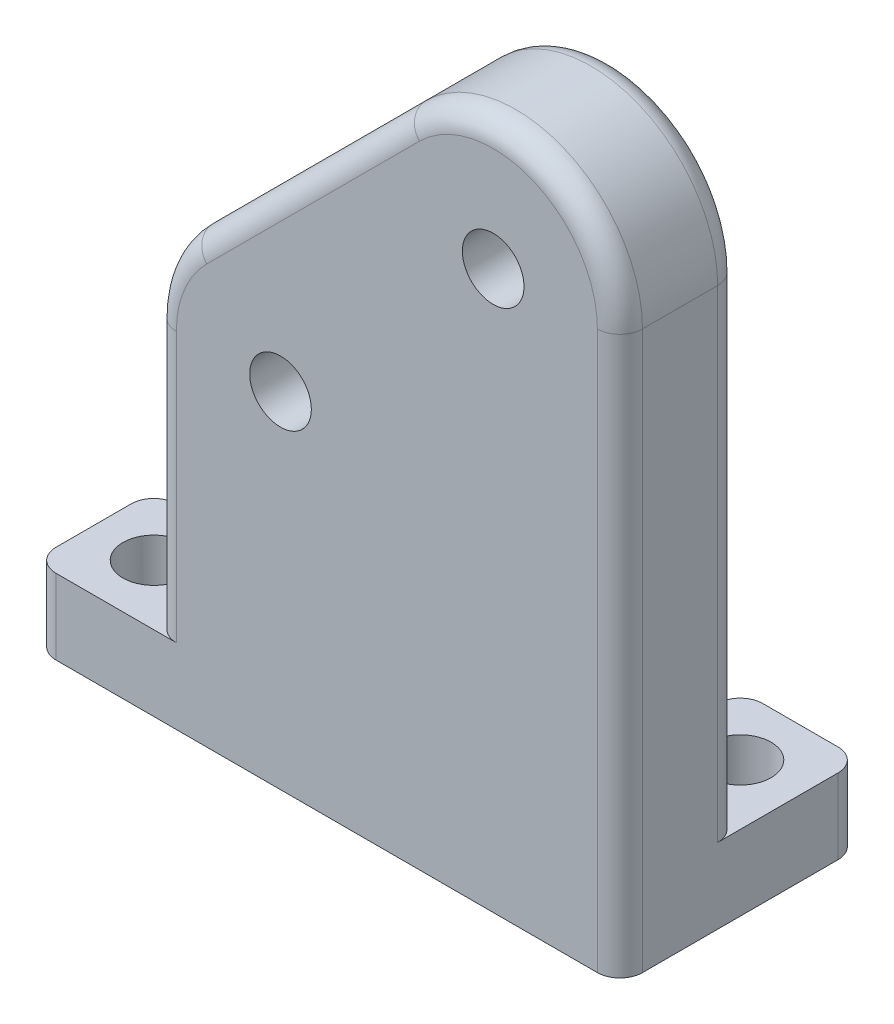
ISO-10303-21;
HEADER;
FILE_DESCRIPTION(('STEP AP214'),'2;1');
FILE_NAME('part.step','',(''),(''),'','','');
FILE_SCHEMA(('AUTOMOTIVE_DESIGN { 1 0 10303 214 1 1 1 1 }'));
ENDSEC;
DATA;
#1=APPLICATION_CONTEXT('core data for automotive mechanical design processes');
#2=APPLICATION_PROTOCOL_DEFINITION('international standard','automotive_design',2000,#1);
#3=PRODUCT_CONTEXT('',#1,'mechanical');
#4=PRODUCT('Part','Part','',(#3));
#5=PRODUCT_RELATED_PRODUCT_CATEGORY('part','',(#4));
#6=PRODUCT_DEFINITION_FORMATION('','',#4);
#7=PRODUCT_DEFINITION_CONTEXT('part definition',#1,'design');
#8=PRODUCT_DEFINITION('design','',#6,#7);
#9=PRODUCT_DEFINITION_SHAPE('','',#8);
#10=(LENGTH_UNIT() NAMED_UNIT(*) SI_UNIT(.MILLI.,.METRE.));
#11=(NAMED_UNIT(*) PLANE_ANGLE_UNIT() SI_UNIT($,.RADIAN.));
#12=(NAMED_UNIT(*) SI_UNIT($,.STERADIAN.) SOLID_ANGLE_UNIT());
#13=UNCERTAINTY_MEASURE_WITH_UNIT(LENGTH_MEASURE(1.E-05),#10,'distance_accuracy_value','');
#14=(GEOMETRIC_REPRESENTATION_CONTEXT(3) GLOBAL_UNCERTAINTY_ASSIGNED_CONTEXT((#13)) GLOBAL_UNIT_ASSIGNED_CONTEXT((#10,
#11,#12)) REPRESENTATION_CONTEXT('',''));
#15=CARTESIAN_POINT('',(0.,0.,0.));
#16=DIRECTION('',(0.,0.,1.));
#17=DIRECTION('',(1.,0.,0.));
#18=AXIS2_PLACEMENT_3D('',#15,#16,#17);
#19=CARTESIAN_POINT('',(16.4289321881346,22.9289321881346,8.));
#20=DIRECTION('',(0.,0.,1.));
#21=DIRECTION('',(1.,0.,0.));
#22=AXIS2_PLACEMENT_3D('',#19,#20,#21);
#23=PLANE('',#22);
#24=CARTESIAN_POINT('',(16.4289321881346,22.9289321881346,8.));
#25=DIRECTION('',(0.,0.,1.));
#26=DIRECTION('',(1.,0.,0.));
#27=AXIS2_PLACEMENT_3D('',#24,#25,#26);
#28=CIRCLE('',#27,2.05);
#29=CARTESIAN_POINT('',(18.4789321881346,22.9289321881346,8.));
#30=VERTEX_POINT('',#29);
#31=EDGE_CURVE('E207',#30,#30,#28,.T.);
#32=ORIENTED_EDGE('',*,*,#31,.F.);
#33=EDGE_LOOP('',(#32));
#34=FACE_BOUND('',#33,.T.);
#35=DIRECTION('',(-1.,0.,0.));
#36=VECTOR('',#35,1.);
#37=CARTESIAN_POINT('',(0.,5.,8.));
#38=LINE('',#37,#36);
#39=CARTESIAN_POINT('',(9.5,5.,8.));
#40=VERTEX_POINT('',#39);
#41=CARTESIAN_POINT('',(1.5,5.,8.));
#42=VERTEX_POINT('',#41);
#43=EDGE_CURVE('E241',#40,#42,#38,.T.);
#44=ORIENTED_EDGE('',*,*,#43,.T.);
#45=DIRECTION('',(0.,-1.,0.));
#46=VECTOR('',#45,1.);
#47=CARTESIAN_POINT('',(1.5,0.,8.));
#48=LINE('',#47,#46);
#49=CARTESIAN_POINT('',(1.5,0.,8.));
#50=VERTEX_POINT('',#49);
#51=EDGE_CURVE('E279',#42,#50,#48,.T.);
#52=ORIENTED_EDGE('',*,*,#51,.T.);
#53=DIRECTION('',(1.,0.,0.));
#54=VECTOR('',#53,1.);
#55=CARTESIAN_POINT('',(0.,0.,8.));
#56=LINE('',#55,#54);
#57=CARTESIAN_POINT('',(37.5,0.,8.));
#58=VERTEX_POINT('',#57);
#59=EDGE_CURVE('E238',#50,#58,#56,.T.);
#60=ORIENTED_EDGE('',*,*,#59,.T.);
#61=DIRECTION('',(0.,1.,0.));
#62=VECTOR('',#61,1.);
#63=CARTESIAN_POINT('',(37.5,37.0710678118656,8.));
#64=LINE('',#63,#62);
#65=CARTESIAN_POINT('',(37.5,37.0710678118656,8.));
#66=VERTEX_POINT('',#65);
#67=EDGE_CURVE('E276',#58,#66,#64,.T.);
#68=ORIENTED_EDGE('',*,*,#67,.T.);
#69=CARTESIAN_POINT('',(30.5710678118654,37.0710678118656,8.));
#70=DIRECTION('',(0.,0.,1.));
#71=DIRECTION('',(1.,0.,0.));
#72=AXIS2_PLACEMENT_3D('',#69,#70,#71);
#73=CIRCLE('',#72,6.92893218813456);
#74=CARTESIAN_POINT('',(25.6715728752538,41.9705627484773,8.));
#75=VERTEX_POINT('',#74);
#76=EDGE_CURVE('E274',#66,#75,#73,.T.);
#77=ORIENTED_EDGE('',*,*,#76,.T.);
#78=DIRECTION('',(-0.707106781186546,-0.707106781186549,0.));
#79=VECTOR('',#78,1.);
#80=CARTESIAN_POINT('',(11.5294372515228,27.8284271247463,8.));
#81=LINE('',#80,#79);
#82=CARTESIAN_POINT('',(11.5294372515228,27.8284271247463,8.));
#83=VERTEX_POINT('',#82);
#84=EDGE_CURVE('E272',#75,#83,#81,.T.);
#85=ORIENTED_EDGE('',*,*,#84,.T.);
#86=CARTESIAN_POINT('',(16.4289321881346,22.9289321881346,8.));
#87=DIRECTION('',(0.,0.,1.));
#88=DIRECTION('',(1.,0.,0.));
#89=AXIS2_PLACEMENT_3D('',#86,#87,#88);
#90=CIRCLE('',#89,6.92893218813458);
#91=CARTESIAN_POINT('',(9.5,22.9289321881346,8.));
#92=VERTEX_POINT('',#91);
#93=EDGE_CURVE('E270',#83,#92,#90,.T.);
#94=ORIENTED_EDGE('',*,*,#93,.T.);
#95=DIRECTION('',(0.,-1.,0.));
#96=VECTOR('',#95,1.);
#97=CARTESIAN_POINT('',(9.5,5.,8.));
#98=LINE('',#97,#96);
#99=EDGE_CURVE('E267',#92,#40,#98,.T.);
#100=ORIENTED_EDGE('',*,*,#99,.T.);
#101=EDGE_LOOP('',(#44,#52,#60,#68,#77,#85,#94,#100));
#102=FACE_BOUND('',#101,.T.);
#103=CARTESIAN_POINT('',(30.5710678118654,37.0710678118656,8.));
#104=DIRECTION('',(0.,0.,1.));
#105=DIRECTION('',(-1.,0.,0.));
#106=AXIS2_PLACEMENT_3D('',#103,#104,#105);
#107=CIRCLE('',#106,2.04999999999999);
#108=CARTESIAN_POINT('',(28.5210678118655,37.0710678118656,8.));
#109=VERTEX_POINT('',#108);
#110=EDGE_CURVE('E228',#109,#109,#107,.T.);
#111=ORIENTED_EDGE('',*,*,#110,.F.);
#112=EDGE_LOOP('',(#111));
#113=FACE_BOUND('',#112,.T.);
#114=ADVANCED_FACE('F39',(#34,#102,#113),#23,.T.);
#115=CARTESIAN_POINT('',(16.4289321881346,22.9289321881346,0.));
#116=DIRECTION('',(0.,0.,1.));
#117=DIRECTION('',(1.,0.,0.));
#118=AXIS2_PLACEMENT_3D('',#115,#116,#117);
#119=PLANE('',#118);
#120=DIRECTION('',(1.,0.,0.));
#121=VECTOR('',#120,1.);
#122=CARTESIAN_POINT('',(0.,0.,0.));
#123=LINE('',#122,#121);
#124=CARTESIAN_POINT('',(1.5,0.,0.));
#125=VERTEX_POINT('',#124);
#126=CARTESIAN_POINT('',(31.0000000000001,0.,0.));
#127=VERTEX_POINT('',#126);
#128=EDGE_CURVE('E199',#125,#127,#123,.T.);
#129=ORIENTED_EDGE('',*,*,#128,.F.);
#130=DIRECTION('',(0.,-1.,0.));
#131=VECTOR('',#130,1.);
#132=CARTESIAN_POINT('',(1.5,22.9289321881346,0.));
#133=LINE('',#132,#131);
#134=CARTESIAN_POINT('',(1.5,5.,0.));
#135=VERTEX_POINT('',#134);
#136=EDGE_CURVE('E310',#125,#135,#133,.F.);
#137=ORIENTED_EDGE('',*,*,#136,.T.);
#138=DIRECTION('',(-1.,0.,0.));
#139=VECTOR('',#138,1.);
#140=CARTESIAN_POINT('',(0.,5.,0.));
#141=LINE('',#140,#139);
#142=CARTESIAN_POINT('',(9.5,5.,0.));
#143=VERTEX_POINT('',#142);
#144=EDGE_CURVE('E206',#143,#135,#141,.T.);
#145=ORIENTED_EDGE('',*,*,#144,.F.);
#146=DIRECTION('',(0.,-1.,0.));
#147=VECTOR('',#146,1.);
#148=CARTESIAN_POINT('',(9.5,22.9289321881346,0.));
#149=LINE('',#148,#147);
#150=CARTESIAN_POINT('',(9.49999999999998,22.9289321881346,0.));
#151=VERTEX_POINT('',#150);
#152=EDGE_CURVE('E302',#143,#151,#149,.F.);
#153=ORIENTED_EDGE('',*,*,#152,.T.);
#154=CARTESIAN_POINT('',(16.4289321881346,22.9289321881346,0.));
#155=DIRECTION('',(0.,0.,1.));
#156=DIRECTION('',(1.,0.,0.));
#157=AXIS2_PLACEMENT_3D('',#154,#155,#156);
#158=CIRCLE('',#157,6.92893218813458);
#159=CARTESIAN_POINT('',(11.5294372515228,27.8284271247463,0.));
#160=VERTEX_POINT('',#159);
#161=EDGE_CURVE('E300',#151,#160,#158,.F.);
#162=ORIENTED_EDGE('',*,*,#161,.T.);
#163=DIRECTION('',(-0.707106781186546,-0.707106781186549,0.));
#164=VECTOR('',#163,1.);
#165=CARTESIAN_POINT('',(11.5294372515228,27.8284271247463,0.));
#166=LINE('',#165,#164);
#167=CARTESIAN_POINT('',(25.6715728752538,41.9705627484773,0.));
#168=VERTEX_POINT('',#167);
#169=EDGE_CURVE('E304',#160,#168,#166,.F.);
#170=ORIENTED_EDGE('',*,*,#169,.T.);
#171=CARTESIAN_POINT('',(30.5710678118654,37.0710678118656,0.));
#172=DIRECTION('',(0.,0.,1.));
#173=DIRECTION('',(1.,0.,0.));
#174=AXIS2_PLACEMENT_3D('',#171,#172,#173);
#175=CIRCLE('',#174,6.92893218813456);
#176=CARTESIAN_POINT('',(37.5,37.0710678118656,0.));
#177=VERTEX_POINT('',#176);
#178=EDGE_CURVE('E306',#168,#177,#175,.F.);
#179=ORIENTED_EDGE('',*,*,#178,.T.);
#180=DIRECTION('',(0.,1.,0.));
#181=VECTOR('',#180,1.);
#182=CARTESIAN_POINT('',(37.5,22.9289321881346,0.));
#183=LINE('',#182,#181);
#184=CARTESIAN_POINT('',(37.5,5.,0.));
#185=VERTEX_POINT('',#184);
#186=EDGE_CURVE('E308',#177,#185,#183,.F.);
#187=ORIENTED_EDGE('',*,*,#186,.T.);
#188=DIRECTION('',(-1.,0.,0.));
#189=VECTOR('',#188,1.);
#190=CARTESIAN_POINT('',(0.,5.,0.));
#191=LINE('',#190,#189);
#192=CARTESIAN_POINT('',(31.0000000000001,5.,0.));
#193=VERTEX_POINT('',#192);
#194=EDGE_CURVE('E213',#185,#193,#191,.T.);
#195=ORIENTED_EDGE('',*,*,#194,.T.);
#196=DIRECTION('',(0.,-1.,0.));
#197=VECTOR('',#196,1.);
#198=CARTESIAN_POINT('',(31.0000000000001,0.,0.));
#199=LINE('',#198,#197);
#200=EDGE_CURVE('E191',#193,#127,#199,.T.);
#201=ORIENTED_EDGE('',*,*,#200,.T.);
#202=EDGE_LOOP('',(#129,#137,#145,#153,#162,#170,#179,#187,#195,#201));
#203=FACE_BOUND('',#202,.T.);
#204=CARTESIAN_POINT('',(16.4289321881346,22.9289321881346,0.));
#205=DIRECTION('',(0.,0.,1.));
#206=DIRECTION('',(1.,0.,0.));
#207=AXIS2_PLACEMENT_3D('',#204,#205,#206);
#208=CIRCLE('',#207,2.05);
#209=CARTESIAN_POINT('',(18.4789321881346,22.9289321881346,0.));
#210=VERTEX_POINT('',#209);
#211=EDGE_CURVE('E231',#210,#210,#208,.T.);
#212=ORIENTED_EDGE('',*,*,#211,.T.);
#213=EDGE_LOOP('',(#212));
#214=FACE_BOUND('',#213,.T.);
#215=CARTESIAN_POINT('',(30.5710678118654,37.0710678118656,0.));
#216=DIRECTION('',(0.,0.,1.));
#217=DIRECTION('',(-1.,0.,0.));
#218=AXIS2_PLACEMENT_3D('',#215,#216,#217);
#219=CIRCLE('',#218,2.04999999999999);
#220=CARTESIAN_POINT('',(28.5210678118655,37.0710678118656,0.));
#221=VERTEX_POINT('',#220);
#222=EDGE_CURVE('E227',#221,#221,#219,.T.);
#223=ORIENTED_EDGE('',*,*,#222,.T.);
#224=EDGE_LOOP('',(#223));
#225=FACE_BOUND('',#224,.T.);
#226=ADVANCED_FACE('F210',(#203,#214,#225),#119,.F.);
#227=CARTESIAN_POINT('',(0.,0.,8.));
#228=DIRECTION('',(1.,0.,0.));
#229=DIRECTION('',(0.,0.,-1.));
#230=AXIS2_PLACEMENT_3D('',#227,#228,#229);
#231=PLANE('',#230);
#232=DIRECTION('',(0.,0.,-1.));
#233=VECTOR('',#232,1.);
#234=CARTESIAN_POINT('',(0.,0.,8.));
#235=LINE('',#234,#233);
#236=CARTESIAN_POINT('',(0.,0.,6.5));
#237=VERTEX_POINT('',#236);
#238=CARTESIAN_POINT('',(0.,0.,1.5));
#239=VERTEX_POINT('',#238);
#240=EDGE_CURVE('E265',#237,#239,#235,.T.);
#241=ORIENTED_EDGE('',*,*,#240,.F.);
#242=DIRECTION('',(0.,-1.,0.));
#243=VECTOR('',#242,1.);
#244=CARTESIAN_POINT('',(0.,5.,6.5));
#245=LINE('',#244,#243);
#246=CARTESIAN_POINT('',(0.,5.,6.5));
#247=VERTEX_POINT('',#246);
#248=EDGE_CURVE('E294',#237,#247,#245,.F.);
#249=ORIENTED_EDGE('',*,*,#248,.T.);
#250=DIRECTION('',(0.,0.,-1.));
#251=VECTOR('',#250,1.);
#252=CARTESIAN_POINT('',(0.,5.,8.));
#253=LINE('',#252,#251);
#254=CARTESIAN_POINT('',(0.,5.,1.5));
#255=VERTEX_POINT('',#254);
#256=EDGE_CURVE('E243',#247,#255,#253,.T.);
#257=ORIENTED_EDGE('',*,*,#256,.T.);
#258=DIRECTION('',(0.,-1.,0.));
#259=VECTOR('',#258,1.);
#260=CARTESIAN_POINT('',(0.,0.,1.5));
#261=LINE('',#260,#259);
#262=EDGE_CURVE('E291',#255,#239,#261,.T.);
#263=ORIENTED_EDGE('',*,*,#262,.T.);
#264=EDGE_LOOP('',(#241,#249,#257,#263));
#265=FACE_BOUND('',#264,.T.);
#266=ADVANCED_FACE('F408',(#265),#231,.F.);
#267=CARTESIAN_POINT('',(0.,0.,8.));
#268=DIRECTION('',(0.,1.,0.));
#269=DIRECTION('',(0.,0.,1.));
#270=AXIS2_PLACEMENT_3D('',#267,#268,#269);
#271=PLANE('',#270);
#272=CARTESIAN_POINT('',(35.,0.,-4.));
#273=DIRECTION('',(0.,1.,0.));
#274=DIRECTION('',(0.,0.,1.));
#275=AXIS2_PLACEMENT_3D('',#272,#273,#274);
#276=CIRCLE('',#275,2.05);
#277=CARTESIAN_POINT('',(35.,0.,-1.95));
#278=VERTEX_POINT('',#277);
#279=EDGE_CURVE('E219',#278,#278,#276,.T.);
#280=ORIENTED_EDGE('',*,*,#279,.T.);
#281=EDGE_LOOP('',(#280));
#282=FACE_BOUND('',#281,.T.);
#283=CARTESIAN_POINT('',(4.,0.,4.));
#284=DIRECTION('',(0.,1.,0.));
#285=DIRECTION('',(0.,0.,1.));
#286=AXIS2_PLACEMENT_3D('',#283,#284,#285);
#287=CIRCLE('',#286,2.05);
#288=CARTESIAN_POINT('',(4.,0.,6.05));
#289=VERTEX_POINT('',#288);
#290=EDGE_CURVE('E214',#289,#289,#287,.T.);
#291=ORIENTED_EDGE('',*,*,#290,.T.);
#292=EDGE_LOOP('',(#291));
#293=FACE_BOUND('',#292,.T.);
#294=ORIENTED_EDGE('',*,*,#59,.F.);
#295=CARTESIAN_POINT('',(1.5,0.,6.5));
#296=DIRECTION('',(0.,1.,0.));
#297=DIRECTION('',(0.,0.,1.));
#298=AXIS2_PLACEMENT_3D('',#295,#296,#297);
#299=CIRCLE('',#298,1.5);
#300=EDGE_CURVE('E289',#50,#237,#299,.F.);
#301=ORIENTED_EDGE('',*,*,#300,.T.);
#302=ORIENTED_EDGE('',*,*,#240,.T.);
#303=CARTESIAN_POINT('',(1.5,0.,1.5));
#304=DIRECTION('',(0.,1.,0.));
#305=DIRECTION('',(0.,0.,1.));
#306=AXIS2_PLACEMENT_3D('',#303,#304,#305);
#307=CIRCLE('',#306,1.5);
#308=EDGE_CURVE('E203',#239,#125,#307,.F.);
#309=ORIENTED_EDGE('',*,*,#308,.T.);
#310=ORIENTED_EDGE('',*,*,#128,.T.);
#311=DIRECTION('',(0.,0.,1.));
#312=VECTOR('',#311,1.);
#313=CARTESIAN_POINT('',(31.0000000000001,0.,-8.));
#314=LINE('',#313,#312);
#315=CARTESIAN_POINT('',(31.0000000000001,0.,-6.5));
#316=VERTEX_POINT('',#315);
#317=EDGE_CURVE('E186',#316,#127,#314,.T.);
#318=ORIENTED_EDGE('',*,*,#317,.F.);
#319=CARTESIAN_POINT('',(32.5000000000001,0.,-6.5));
#320=DIRECTION('',(0.,1.,0.));
#321=DIRECTION('',(0.,0.,1.));
#322=AXIS2_PLACEMENT_3D('',#319,#320,#321);
#323=CIRCLE('',#322,1.5);
#324=CARTESIAN_POINT('',(32.5000000000001,0.,-8.));
#325=VERTEX_POINT('',#324);
#326=EDGE_CURVE('E286',#316,#325,#323,.F.);
#327=ORIENTED_EDGE('',*,*,#326,.T.);
#328=DIRECTION('',(-1.,0.,0.));
#329=VECTOR('',#328,1.);
#330=CARTESIAN_POINT('',(0.,0.,-8.));
#331=LINE('',#330,#329);
#332=CARTESIAN_POINT('',(37.5,0.,-8.));
#333=VERTEX_POINT('',#332);
#334=EDGE_CURVE('E196',#333,#325,#331,.T.);
#335=ORIENTED_EDGE('',*,*,#334,.F.);
#336=CARTESIAN_POINT('',(37.5,0.,-6.5));
#337=DIRECTION('',(0.,1.,0.));
#338=DIRECTION('',(0.,0.,1.));
#339=AXIS2_PLACEMENT_3D('',#336,#337,#338);
#340=CIRCLE('',#339,1.5);
#341=CARTESIAN_POINT('',(39.,0.,-6.5));
#342=VERTEX_POINT('',#341);
#343=EDGE_CURVE('E284',#333,#342,#340,.F.);
#344=ORIENTED_EDGE('',*,*,#343,.T.);
#345=DIRECTION('',(0.,0.,-1.));
#346=VECTOR('',#345,1.);
#347=CARTESIAN_POINT('',(39.,0.,8.));
#348=LINE('',#347,#346);
#349=CARTESIAN_POINT('',(39.,0.,6.5));
#350=VERTEX_POINT('',#349);
#351=EDGE_CURVE('E262',#350,#342,#348,.T.);
#352=ORIENTED_EDGE('',*,*,#351,.F.);
#353=CARTESIAN_POINT('',(37.5,0.,6.5));
#354=DIRECTION('',(0.,1.,0.));
#355=DIRECTION('',(0.,0.,1.));
#356=AXIS2_PLACEMENT_3D('',#353,#354,#355);
#357=CIRCLE('',#356,1.5);
#358=EDGE_CURVE('E282',#350,#58,#357,.F.);
#359=ORIENTED_EDGE('',*,*,#358,.T.);
#360=EDGE_LOOP('',(#294,#301,#302,#309,#310,#318,#327,#335,#344,#352,#359));
#361=FACE_BOUND('',#360,.T.);
#362=ADVANCED_FACE('F201',(#282,#293,#361),#271,.F.);
#363=CARTESIAN_POINT('',(39.,0.,8.));
#364=DIRECTION('',(-1.,0.,0.));
#365=DIRECTION('',(0.,-1.,0.));
#366=AXIS2_PLACEMENT_3D('',#363,#364,#365);
#367=PLANE('',#366);
#368=ORIENTED_EDGE('',*,*,#351,.T.);
#369=DIRECTION('',(0.,-1.,0.));
#370=VECTOR('',#369,1.);
#371=CARTESIAN_POINT('',(39.,5.,-6.5));
#372=LINE('',#371,#370);
#373=CARTESIAN_POINT('',(39.,5.,-6.5));
#374=VERTEX_POINT('',#373);
#375=EDGE_CURVE('E327',#342,#374,#372,.F.);
#376=ORIENTED_EDGE('',*,*,#375,.T.);
#377=DIRECTION('',(0.,0.,1.));
#378=VECTOR('',#377,1.);
#379=CARTESIAN_POINT('',(39.,5.,-8.));
#380=LINE('',#379,#378);
#381=CARTESIAN_POINT('',(39.,5.,1.5));
#382=VERTEX_POINT('',#381);
#383=EDGE_CURVE('E195',#374,#382,#380,.T.);
#384=ORIENTED_EDGE('',*,*,#383,.T.);
#385=DIRECTION('',(0.,1.,0.));
#386=VECTOR('',#385,1.);
#387=CARTESIAN_POINT('',(39.,0.,1.5));
#388=LINE('',#387,#386);
#389=CARTESIAN_POINT('',(39.,37.0710678118656,1.5));
#390=VERTEX_POINT('',#389);
#391=EDGE_CURVE('E324',#382,#390,#388,.T.);
#392=ORIENTED_EDGE('',*,*,#391,.T.);
#393=DIRECTION('',(0.,0.,-1.));
#394=VECTOR('',#393,1.);
#395=CARTESIAN_POINT('',(39.,37.0710678118656,8.));
#396=LINE('',#395,#394);
#397=CARTESIAN_POINT('',(39.,37.0710678118656,6.5));
#398=VERTEX_POINT('',#397);
#399=EDGE_CURVE('E259',#398,#390,#396,.T.);
#400=ORIENTED_EDGE('',*,*,#399,.F.);
#401=DIRECTION('',(0.,1.,0.));
#402=VECTOR('',#401,1.);
#403=CARTESIAN_POINT('',(39.,0.,6.5));
#404=LINE('',#403,#402);
#405=EDGE_CURVE('E322',#398,#350,#404,.F.);
#406=ORIENTED_EDGE('',*,*,#405,.T.);
#407=EDGE_LOOP('',(#368,#376,#384,#392,#400,#406));
#408=FACE_BOUND('',#407,.T.);
#409=ADVANCED_FACE('F395',(#408),#367,.F.);
#410=CARTESIAN_POINT('',(30.5710678118654,37.0710678118656,8.));
#411=DIRECTION('',(0.,0.,-1.));
#412=DIRECTION('',(-1.,0.,0.));
#413=AXIS2_PLACEMENT_3D('',#410,#411,#412);
#414=CYLINDRICAL_SURFACE('',#413,8.42893218813456);
#415=ORIENTED_EDGE('',*,*,#399,.T.);
#416=CARTESIAN_POINT('',(30.5710678118654,37.0710678118656,1.5));
#417=DIRECTION('',(0.,0.,1.));
#418=DIRECTION('',(1.,0.,0.));
#419=AXIS2_PLACEMENT_3D('',#416,#417,#418);
#420=CIRCLE('',#419,8.42893218813456);
#421=CARTESIAN_POINT('',(24.6109127034739,43.0312229202571,1.5));
#422=VERTEX_POINT('',#421);
#423=EDGE_CURVE('E331',#390,#422,#420,.T.);
#424=ORIENTED_EDGE('',*,*,#423,.T.);
#425=DIRECTION('',(0.,0.,-1.));
#426=VECTOR('',#425,1.);
#427=CARTESIAN_POINT('',(24.6109127034739,43.0312229202571,8.));
#428=LINE('',#427,#426);
#429=CARTESIAN_POINT('',(24.6109127034739,43.0312229202571,6.5));
#430=VERTEX_POINT('',#429);
#431=EDGE_CURVE('E257',#430,#422,#428,.T.);
#432=ORIENTED_EDGE('',*,*,#431,.F.);
#433=CARTESIAN_POINT('',(30.5710678118654,37.0710678118656,6.5));
#434=DIRECTION('',(0.,0.,1.));
#435=DIRECTION('',(1.,0.,0.));
#436=AXIS2_PLACEMENT_3D('',#433,#434,#435);
#437=CIRCLE('',#436,8.42893218813456);
#438=EDGE_CURVE('E329',#430,#398,#437,.F.);
#439=ORIENTED_EDGE('',*,*,#438,.T.);
#440=EDGE_LOOP('',(#415,#424,#432,#439));
#441=FACE_BOUND('',#440,.T.);
#442=ADVANCED_FACE('F392',(#441),#414,.T.);
#443=CARTESIAN_POINT('',(10.468777079743,28.8890872965261,8.));
#444=DIRECTION('',(0.707106781186549,-0.707106781186546,0.));
#445=DIRECTION('',(0.707106781186546,0.707106781186549,0.));
#446=AXIS2_PLACEMENT_3D('',#443,#444,#445);
#447=PLANE('',#446);
#448=DIRECTION('',(0.,0.,-1.));
#449=VECTOR('',#448,1.);
#450=CARTESIAN_POINT('',(10.468777079743,28.8890872965261,8.));
#451=LINE('',#450,#449);
#452=CARTESIAN_POINT('',(10.468777079743,28.8890872965261,6.5));
#453=VERTEX_POINT('',#452);
#454=CARTESIAN_POINT('',(10.468777079743,28.8890872965261,1.5));
#455=VERTEX_POINT('',#454);
#456=EDGE_CURVE('E255',#453,#455,#451,.T.);
#457=ORIENTED_EDGE('',*,*,#456,.F.);
#458=DIRECTION('',(-0.707106781186546,-0.707106781186549,0.));
#459=VECTOR('',#458,1.);
#460=CARTESIAN_POINT('',(24.6109127034739,43.0312229202571,6.5));
#461=LINE('',#460,#459);
#462=EDGE_CURVE('E337',#453,#430,#461,.F.);
#463=ORIENTED_EDGE('',*,*,#462,.T.);
#464=ORIENTED_EDGE('',*,*,#431,.T.);
#465=DIRECTION('',(-0.707106781186546,-0.707106781186549,0.));
#466=VECTOR('',#465,1.);
#467=CARTESIAN_POINT('',(10.468777079743,28.8890872965261,1.5));
#468=LINE('',#467,#466);
#469=EDGE_CURVE('E56',#422,#455,#468,.T.);
#470=ORIENTED_EDGE('',*,*,#469,.T.);
#471=EDGE_LOOP('',(#457,#463,#464,#470));
#472=FACE_BOUND('',#471,.T.);
#473=ADVANCED_FACE('F499',(#472),#447,.F.);
#474=CARTESIAN_POINT('',(16.4289321881346,22.9289321881346,8.));
#475=DIRECTION('',(0.,0.,-1.));
#476=DIRECTION('',(-1.,0.,0.));
#477=AXIS2_PLACEMENT_3D('',#474,#475,#476);
#478=CYLINDRICAL_SURFACE('',#477,8.42893218813458);
#479=DIRECTION('',(0.,0.,-1.));
#480=VECTOR('',#479,1.);
#481=CARTESIAN_POINT('',(7.99999999999998,22.9289321881346,8.));
#482=LINE('',#481,#480);
#483=CARTESIAN_POINT('',(7.99999999999998,22.9289321881346,6.5));
#484=VERTEX_POINT('',#483);
#485=CARTESIAN_POINT('',(7.99999999999998,22.9289321881346,1.5));
#486=VERTEX_POINT('',#485);
#487=EDGE_CURVE('E252',#484,#486,#482,.T.);
#488=ORIENTED_EDGE('',*,*,#487,.F.);
#489=CARTESIAN_POINT('',(16.4289321881346,22.9289321881346,6.5));
#490=DIRECTION('',(0.,0.,1.));
#491=DIRECTION('',(1.,0.,0.));
#492=AXIS2_PLACEMENT_3D('',#489,#490,#491);
#493=CIRCLE('',#492,8.42893218813458);
#494=EDGE_CURVE('E63',#484,#453,#493,.F.);
#495=ORIENTED_EDGE('',*,*,#494,.T.);
#496=ORIENTED_EDGE('',*,*,#456,.T.);
#497=CARTESIAN_POINT('',(16.4289321881346,22.9289321881346,1.5));
#498=DIRECTION('',(0.,0.,1.));
#499=DIRECTION('',(1.,0.,0.));
#500=AXIS2_PLACEMENT_3D('',#497,#498,#499);
#501=CIRCLE('',#500,8.42893218813458);
#502=EDGE_CURVE('E333',#455,#486,#501,.T.);
#503=ORIENTED_EDGE('',*,*,#502,.T.);
#504=EDGE_LOOP('',(#488,#495,#496,#503));
#505=FACE_BOUND('',#504,.T.);
#506=ADVANCED_FACE('F495',(#505),#478,.T.);
#507=CARTESIAN_POINT('',(8.,5.,8.));
#508=DIRECTION('',(1.,0.,0.));
#509=DIRECTION('',(0.,0.,-1.));
#510=AXIS2_PLACEMENT_3D('',#507,#508,#509);
#511=PLANE('',#510);
#512=ORIENTED_EDGE('',*,*,#487,.T.);
#513=DIRECTION('',(0.,-1.,0.));
#514=VECTOR('',#513,1.);
#515=CARTESIAN_POINT('',(8.,5.,1.5));
#516=LINE('',#515,#514);
#517=CARTESIAN_POINT('',(8.,5.,1.5));
#518=VERTEX_POINT('',#517);
#519=EDGE_CURVE('E341',#486,#518,#516,.T.);
#520=ORIENTED_EDGE('',*,*,#519,.T.);
#521=DIRECTION('',(0.,0.,-1.));
#522=VECTOR('',#521,1.);
#523=CARTESIAN_POINT('',(8.,5.,8.));
#524=LINE('',#523,#522);
#525=CARTESIAN_POINT('',(8.,5.,6.5));
#526=VERTEX_POINT('',#525);
#527=EDGE_CURVE('E249',#526,#518,#524,.T.);
#528=ORIENTED_EDGE('',*,*,#527,.F.);
#529=DIRECTION('',(0.,-1.,0.));
#530=VECTOR('',#529,1.);
#531=CARTESIAN_POINT('',(8.,22.9289321881346,6.5));
#532=LINE('',#531,#530);
#533=EDGE_CURVE('E339',#526,#484,#532,.F.);
#534=ORIENTED_EDGE('',*,*,#533,.T.);
#535=EDGE_LOOP('',(#512,#520,#528,#534));
#536=FACE_BOUND('',#535,.T.);
#537=ADVANCED_FACE('F491',(#536),#511,.F.);
#538=CARTESIAN_POINT('',(0.,5.,8.));
#539=DIRECTION('',(0.,-1.,0.));
#540=DIRECTION('',(0.,0.,-1.));
#541=AXIS2_PLACEMENT_3D('',#538,#539,#540);
#542=PLANE('',#541);
#543=CARTESIAN_POINT('',(4.,5.,4.));
#544=DIRECTION('',(0.,1.,0.));
#545=DIRECTION('',(-1.,0.,0.));
#546=AXIS2_PLACEMENT_3D('',#543,#544,#545);
#547=CIRCLE('',#546,2.05);
#548=CARTESIAN_POINT('',(1.95,5.,4.));
#549=VERTEX_POINT('',#548);
#550=EDGE_CURVE('E359',#549,#549,#547,.T.);
#551=ORIENTED_EDGE('',*,*,#550,.F.);
#552=EDGE_LOOP('',(#551));
#553=FACE_BOUND('',#552,.T.);
#554=ORIENTED_EDGE('',*,*,#256,.F.);
#555=CARTESIAN_POINT('',(1.5,5.,6.5));
#556=DIRECTION('',(0.,-1.,0.));
#557=DIRECTION('',(0.,0.,-1.));
#558=AXIS2_PLACEMENT_3D('',#555,#556,#557);
#559=CIRCLE('',#558,1.5);
#560=EDGE_CURVE('E298',#247,#42,#559,.F.);
#561=ORIENTED_EDGE('',*,*,#560,.T.);
#562=ORIENTED_EDGE('',*,*,#43,.F.);
#563=CARTESIAN_POINT('',(9.5,5.,6.5));
#564=DIRECTION('',(0.,-1.,0.));
#565=DIRECTION('',(0.,0.,-1.));
#566=AXIS2_PLACEMENT_3D('',#563,#564,#565);
#567=CIRCLE('',#566,1.5);
#568=EDGE_CURVE('E11',#40,#526,#567,.T.);
#569=ORIENTED_EDGE('',*,*,#568,.T.);
#570=ORIENTED_EDGE('',*,*,#527,.T.);
#571=CARTESIAN_POINT('',(9.5,5.,1.5));
#572=DIRECTION('',(0.,-1.,0.));
#573=DIRECTION('',(0.,0.,-1.));
#574=AXIS2_PLACEMENT_3D('',#571,#572,#573);
#575=CIRCLE('',#574,1.5);
#576=EDGE_CURVE('E48',#518,#143,#575,.T.);
#577=ORIENTED_EDGE('',*,*,#576,.T.);
#578=ORIENTED_EDGE('',*,*,#144,.T.);
#579=CARTESIAN_POINT('',(1.5,5.,1.5));
#580=DIRECTION('',(0.,-1.,0.));
#581=DIRECTION('',(0.,0.,-1.));
#582=AXIS2_PLACEMENT_3D('',#579,#580,#581);
#583=CIRCLE('',#582,1.5);
#584=EDGE_CURVE('E296',#135,#255,#583,.F.);
#585=ORIENTED_EDGE('',*,*,#584,.T.);
#586=EDGE_LOOP('',(#554,#561,#562,#569,#570,#577,#578,#585));
#587=FACE_BOUND('',#586,.T.);
#588=ADVANCED_FACE('F415',(#553,#587),#542,.F.);
#589=CARTESIAN_POINT('',(16.4289321881346,22.9289321881346,8.));
#590=DIRECTION('',(0.,0.,-1.));
#591=DIRECTION('',(-1.,0.,0.));
#592=AXIS2_PLACEMENT_3D('',#589,#590,#591);
#593=CYLINDRICAL_SURFACE('',#592,2.05);
#594=ORIENTED_EDGE('',*,*,#31,.T.);
#595=EDGE_LOOP('',(#594));
#596=FACE_BOUND('',#595,.T.);
#597=ORIENTED_EDGE('',*,*,#211,.F.);
#598=EDGE_LOOP('',(#597));
#599=FACE_BOUND('',#598,.T.);
#600=ADVANCED_FACE('F486',(#596,#599),#593,.F.);
#601=CARTESIAN_POINT('',(30.5710678118654,37.0710678118656,8.));
#602=DIRECTION('',(0.,0.,-1.));
#603=DIRECTION('',(-1.,0.,0.));
#604=AXIS2_PLACEMENT_3D('',#601,#602,#603);
#605=CYLINDRICAL_SURFACE('',#604,2.04999999999999);
#606=ORIENTED_EDGE('',*,*,#110,.T.);
#607=EDGE_LOOP('',(#606));
#608=FACE_BOUND('',#607,.T.);
#609=ORIENTED_EDGE('',*,*,#222,.F.);
#610=EDGE_LOOP('',(#609));
#611=FACE_BOUND('',#610,.T.);
#612=ADVANCED_FACE('F475',(#608,#611),#605,.F.);
#613=CARTESIAN_POINT('',(31.0000000000001,0.,-8.));
#614=DIRECTION('',(-1.,0.,0.));
#615=DIRECTION('',(0.,0.,1.));
#616=AXIS2_PLACEMENT_3D('',#613,#614,#615);
#617=PLANE('',#616);
#618=DIRECTION('',(0.,0.,1.));
#619=VECTOR('',#618,1.);
#620=CARTESIAN_POINT('',(31.0000000000001,5.,-8.));
#621=LINE('',#620,#619);
#622=CARTESIAN_POINT('',(31.0000000000001,5.,-6.5));
#623=VERTEX_POINT('',#622);
#624=EDGE_CURVE('E225',#623,#193,#621,.T.);
#625=ORIENTED_EDGE('',*,*,#624,.F.);
#626=DIRECTION('',(0.,-1.,0.));
#627=VECTOR('',#626,1.);
#628=CARTESIAN_POINT('',(31.0000000000001,0.,-6.5));
#629=LINE('',#628,#627);
#630=EDGE_CURVE('E193',#623,#316,#629,.T.);
#631=ORIENTED_EDGE('',*,*,#630,.T.);
#632=ORIENTED_EDGE('',*,*,#317,.T.);
#633=ORIENTED_EDGE('',*,*,#200,.F.);
#634=EDGE_LOOP('',(#625,#631,#632,#633));
#635=FACE_BOUND('',#634,.T.);
#636=ADVANCED_FACE('F189',(#635),#617,.T.);
#637=CARTESIAN_POINT('',(0.,5.,-8.));
#638=DIRECTION('',(0.,1.,0.));
#639=DIRECTION('',(-1.,0.,0.));
#640=AXIS2_PLACEMENT_3D('',#637,#638,#639);
#641=PLANE('',#640);
#642=CARTESIAN_POINT('',(35.,5.,-4.));
#643=DIRECTION('',(0.,1.,0.));
#644=DIRECTION('',(-1.,0.,0.));
#645=AXIS2_PLACEMENT_3D('',#642,#643,#644);
#646=CIRCLE('',#645,2.05);
#647=CARTESIAN_POINT('',(32.95,5.,-4.));
#648=VERTEX_POINT('',#647);
#649=EDGE_CURVE('E459',#648,#648,#646,.T.);
#650=ORIENTED_EDGE('',*,*,#649,.F.);
#651=EDGE_LOOP('',(#650));
#652=FACE_BOUND('',#651,.T.);
#653=DIRECTION('',(-1.,0.,0.));
#654=VECTOR('',#653,1.);
#655=CARTESIAN_POINT('',(0.,5.,-8.));
#656=LINE('',#655,#654);
#657=CARTESIAN_POINT('',(37.5,5.,-8.));
#658=VERTEX_POINT('',#657);
#659=CARTESIAN_POINT('',(32.5000000000001,5.,-8.));
#660=VERTEX_POINT('',#659);
#661=EDGE_CURVE('E216',#658,#660,#656,.T.);
#662=ORIENTED_EDGE('',*,*,#661,.T.);
#663=CARTESIAN_POINT('',(32.5000000000001,5.,-6.5));
#664=DIRECTION('',(0.,1.,0.));
#665=DIRECTION('',(-1.,0.,0.));
#666=AXIS2_PLACEMENT_3D('',#663,#664,#665);
#667=CIRCLE('',#666,1.5);
#668=EDGE_CURVE('E320',#660,#623,#667,.T.);
#669=ORIENTED_EDGE('',*,*,#668,.T.);
#670=ORIENTED_EDGE('',*,*,#624,.T.);
#671=ORIENTED_EDGE('',*,*,#194,.F.);
#672=CARTESIAN_POINT('',(37.5,5.,1.5));
#673=DIRECTION('',(0.,1.,0.));
#674=DIRECTION('',(-1.,0.,0.));
#675=AXIS2_PLACEMENT_3D('',#672,#673,#674);
#676=CIRCLE('',#675,1.5);
#677=EDGE_CURVE('E343',#185,#382,#676,.F.);
#678=ORIENTED_EDGE('',*,*,#677,.T.);
#679=ORIENTED_EDGE('',*,*,#383,.F.);
#680=CARTESIAN_POINT('',(37.5,5.,-6.5));
#681=DIRECTION('',(0.,1.,0.));
#682=DIRECTION('',(-1.,0.,0.));
#683=AXIS2_PLACEMENT_3D('',#680,#681,#682);
#684=CIRCLE('',#683,1.5);
#685=EDGE_CURVE('E318',#374,#658,#684,.T.);
#686=ORIENTED_EDGE('',*,*,#685,.T.);
#687=EDGE_LOOP('',(#662,#669,#670,#671,#678,#679,#686));
#688=FACE_BOUND('',#687,.T.);
#689=ADVANCED_FACE('F444',(#652,#688),#641,.T.);
#690=CARTESIAN_POINT('',(0.,0.,-8.));
#691=DIRECTION('',(0.,0.,-1.));
#692=DIRECTION('',(-1.,0.,0.));
#693=AXIS2_PLACEMENT_3D('',#690,#691,#692);
#694=PLANE('',#693);
#695=ORIENTED_EDGE('',*,*,#334,.T.);
#696=DIRECTION('',(0.,-1.,0.));
#697=VECTOR('',#696,1.);
#698=CARTESIAN_POINT('',(32.5000000000001,0.,-8.));
#699=LINE('',#698,#697);
#700=EDGE_CURVE('E316',#325,#660,#699,.F.);
#701=ORIENTED_EDGE('',*,*,#700,.T.);
#702=ORIENTED_EDGE('',*,*,#661,.F.);
#703=DIRECTION('',(0.,-1.,0.));
#704=VECTOR('',#703,1.);
#705=CARTESIAN_POINT('',(37.5,0.,-8.));
#706=LINE('',#705,#704);
#707=EDGE_CURVE('E313',#658,#333,#706,.T.);
#708=ORIENTED_EDGE('',*,*,#707,.T.);
#709=EDGE_LOOP('',(#695,#701,#702,#708));
#710=FACE_BOUND('',#709,.T.);
#711=ADVANCED_FACE('F453',(#710),#694,.T.);
#712=CARTESIAN_POINT('',(35.,-5.,-4.));
#713=DIRECTION('',(0.,1.,0.));
#714=DIRECTION('',(-1.,0.,0.));
#715=AXIS2_PLACEMENT_3D('',#712,#713,#714);
#716=CYLINDRICAL_SURFACE('',#715,2.05);
#717=ORIENTED_EDGE('',*,*,#649,.T.);
#718=EDGE_LOOP('',(#717));
#719=FACE_BOUND('',#718,.T.);
#720=ORIENTED_EDGE('',*,*,#279,.F.);
#721=EDGE_LOOP('',(#720));
#722=FACE_BOUND('',#721,.T.);
#723=ADVANCED_FACE('F465',(#719,#722),#716,.F.);
#724=CARTESIAN_POINT('',(4.,-5.,4.));
#725=DIRECTION('',(0.,1.,0.));
#726=DIRECTION('',(-1.,0.,0.));
#727=AXIS2_PLACEMENT_3D('',#724,#725,#726);
#728=CYLINDRICAL_SURFACE('',#727,2.05);
#729=ORIENTED_EDGE('',*,*,#550,.T.);
#730=EDGE_LOOP('',(#729));
#731=FACE_BOUND('',#730,.T.);
#732=ORIENTED_EDGE('',*,*,#290,.F.);
#733=EDGE_LOOP('',(#732));
#734=FACE_BOUND('',#733,.T.);
#735=ADVANCED_FACE('F513',(#731,#734),#728,.F.);
#736=CARTESIAN_POINT('',(1.5,22.9289321881346,6.5));
#737=DIRECTION('',(0.,1.,0.));
#738=DIRECTION('',(0.,0.,1.));
#739=AXIS2_PLACEMENT_3D('',#736,#737,#738);
#740=CYLINDRICAL_SURFACE('',#739,1.5);
#741=ORIENTED_EDGE('',*,*,#560,.F.);
#742=ORIENTED_EDGE('',*,*,#248,.F.);
#743=ORIENTED_EDGE('',*,*,#300,.F.);
#744=ORIENTED_EDGE('',*,*,#51,.F.);
#745=EDGE_LOOP('',(#741,#742,#743,#744));
#746=FACE_BOUND('',#745,.T.);
#747=ADVANCED_FACE('F404',(#746),#740,.T.);
#748=CARTESIAN_POINT('',(1.5,0.,1.5));
#749=DIRECTION('',(0.,-1.,0.));
#750=DIRECTION('',(0.,0.,-1.));
#751=AXIS2_PLACEMENT_3D('',#748,#749,#750);
#752=CYLINDRICAL_SURFACE('',#751,1.5);
#753=ORIENTED_EDGE('',*,*,#584,.F.);
#754=ORIENTED_EDGE('',*,*,#136,.F.);
#755=ORIENTED_EDGE('',*,*,#308,.F.);
#756=ORIENTED_EDGE('',*,*,#262,.F.);
#757=EDGE_LOOP('',(#753,#754,#755,#756));
#758=FACE_BOUND('',#757,.T.);
#759=ADVANCED_FACE('F413',(#758),#752,.T.);
#760=CARTESIAN_POINT('',(32.5000000000001,0.,-6.5));
#761=DIRECTION('',(0.,-1.,0.));
#762=DIRECTION('',(0.,0.,-1.));
#763=AXIS2_PLACEMENT_3D('',#760,#761,#762);
#764=CYLINDRICAL_SURFACE('',#763,1.5);
#765=ORIENTED_EDGE('',*,*,#668,.F.);
#766=ORIENTED_EDGE('',*,*,#700,.F.);
#767=ORIENTED_EDGE('',*,*,#326,.F.);
#768=ORIENTED_EDGE('',*,*,#630,.F.);
#769=EDGE_LOOP('',(#765,#766,#767,#768));
#770=FACE_BOUND('',#769,.T.);
#771=ADVANCED_FACE('F448',(#770),#764,.T.);
#772=CARTESIAN_POINT('',(37.5,0.,-6.5));
#773=DIRECTION('',(0.,1.,0.));
#774=DIRECTION('',(-1.,0.,0.));
#775=AXIS2_PLACEMENT_3D('',#772,#773,#774);
#776=CYLINDRICAL_SURFACE('',#775,1.5);
#777=ORIENTED_EDGE('',*,*,#685,.F.);
#778=ORIENTED_EDGE('',*,*,#375,.F.);
#779=ORIENTED_EDGE('',*,*,#343,.F.);
#780=ORIENTED_EDGE('',*,*,#707,.F.);
#781=EDGE_LOOP('',(#777,#778,#779,#780));
#782=FACE_BOUND('',#781,.T.);
#783=ADVANCED_FACE('F518',(#782),#776,.T.);
#784=CARTESIAN_POINT('',(9.5,5.,1.5));
#785=DIRECTION('',(0.,-1.,0.));
#786=DIRECTION('',(0.,0.,-1.));
#787=AXIS2_PLACEMENT_3D('',#784,#785,#786);
#788=CYLINDRICAL_SURFACE('',#787,1.5);
#789=ORIENTED_EDGE('',*,*,#576,.F.);
#790=ORIENTED_EDGE('',*,*,#519,.F.);
#791=CARTESIAN_POINT('',(9.5,22.9289321881346,1.5));
#792=DIRECTION('',(0.,1.,0.));
#793=DIRECTION('',(0.,0.,1.));
#794=AXIS2_PLACEMENT_3D('',#791,#792,#793);
#795=CIRCLE('',#794,1.5);
#796=EDGE_CURVE('E356',#151,#486,#795,.T.);
#797=ORIENTED_EDGE('',*,*,#796,.F.);
#798=ORIENTED_EDGE('',*,*,#152,.F.);
#799=EDGE_LOOP('',(#789,#790,#797,#798));
#800=FACE_BOUND('',#799,.T.);
#801=ADVANCED_FACE('F422',(#800),#788,.T.);
#802=CARTESIAN_POINT('',(16.4289321881346,22.9289321881346,1.5));
#803=DIRECTION('',(0.,0.,1.));
#804=DIRECTION('',(1.,0.,0.));
#805=AXIS2_PLACEMENT_3D('',#802,#803,#804);
#806=TOROIDAL_SURFACE('',#805,6.92893218813458,1.5);
#807=ORIENTED_EDGE('',*,*,#796,.T.);
#808=ORIENTED_EDGE('',*,*,#502,.F.);
#809=CARTESIAN_POINT('',(11.5294372515228,27.8284271247463,1.5));
#810=DIRECTION('',(0.707106781186545,0.70710678118655,0.));
#811=DIRECTION('',(-0.70710678118655,0.707106781186545,0.));
#812=AXIS2_PLACEMENT_3D('',#809,#810,#811);
#813=CIRCLE('',#812,1.5);
#814=EDGE_CURVE('E353',#160,#455,#813,.T.);
#815=ORIENTED_EDGE('',*,*,#814,.F.);
#816=ORIENTED_EDGE('',*,*,#161,.F.);
#817=EDGE_LOOP('',(#807,#808,#815,#816));
#818=FACE_BOUND('',#817,.T.);
#819=ADVANCED_FACE('F429',(#818),#806,.T.);
#820=CARTESIAN_POINT('',(11.5294372515228,27.8284271247463,1.5));
#821=DIRECTION('',(-0.707106781186546,-0.707106781186549,0.));
#822=DIRECTION('',(0.707106781186549,-0.707106781186546,0.));
#823=AXIS2_PLACEMENT_3D('',#820,#821,#822);
#824=CYLINDRICAL_SURFACE('',#823,1.5);
#825=ORIENTED_EDGE('',*,*,#814,.T.);
#826=ORIENTED_EDGE('',*,*,#469,.F.);
#827=CARTESIAN_POINT('',(25.6715728752538,41.9705627484773,1.5));
#828=DIRECTION('',(0.707106781186545,0.70710678118655,0.));
#829=DIRECTION('',(-0.70710678118655,0.707106781186545,0.));
#830=AXIS2_PLACEMENT_3D('',#827,#828,#829);
#831=CIRCLE('',#830,1.5);
#832=EDGE_CURVE('E350',#168,#422,#831,.T.);
#833=ORIENTED_EDGE('',*,*,#832,.F.);
#834=ORIENTED_EDGE('',*,*,#169,.F.);
#835=EDGE_LOOP('',(#825,#826,#833,#834));
#836=FACE_BOUND('',#835,.T.);
#837=ADVANCED_FACE('F431',(#836),#824,.T.);
#838=CARTESIAN_POINT('',(30.5710678118654,37.0710678118656,1.5));
#839=DIRECTION('',(0.,0.,1.));
#840=DIRECTION('',(1.,0.,0.));
#841=AXIS2_PLACEMENT_3D('',#838,#839,#840);
#842=TOROIDAL_SURFACE('',#841,6.92893218813456,1.5);
#843=ORIENTED_EDGE('',*,*,#832,.T.);
#844=ORIENTED_EDGE('',*,*,#423,.F.);
#845=CARTESIAN_POINT('',(37.5,37.0710678118656,1.5));
#846=DIRECTION('',(0.,-1.,0.));
#847=DIRECTION('',(0.,0.,-1.));
#848=AXIS2_PLACEMENT_3D('',#845,#846,#847);
#849=CIRCLE('',#848,1.5);
#850=EDGE_CURVE('E348',#177,#390,#849,.T.);
#851=ORIENTED_EDGE('',*,*,#850,.F.);
#852=ORIENTED_EDGE('',*,*,#178,.F.);
#853=EDGE_LOOP('',(#843,#844,#851,#852));
#854=FACE_BOUND('',#853,.T.);
#855=ADVANCED_FACE('F436',(#854),#842,.T.);
#856=CARTESIAN_POINT('',(37.5,0.,1.5));
#857=DIRECTION('',(0.,1.,0.));
#858=DIRECTION('',(-1.,0.,0.));
#859=AXIS2_PLACEMENT_3D('',#856,#857,#858);
#860=CYLINDRICAL_SURFACE('',#859,1.5);
#861=ORIENTED_EDGE('',*,*,#677,.F.);
#862=ORIENTED_EDGE('',*,*,#186,.F.);
#863=ORIENTED_EDGE('',*,*,#850,.T.);
#864=ORIENTED_EDGE('',*,*,#391,.F.);
#865=EDGE_LOOP('',(#861,#862,#863,#864));
#866=FACE_BOUND('',#865,.T.);
#867=ADVANCED_FACE('F440',(#866),#860,.T.);
#868=CARTESIAN_POINT('',(9.5,22.9289321881346,6.5));
#869=DIRECTION('',(0.,1.,0.));
#870=DIRECTION('',(0.,0.,1.));
#871=AXIS2_PLACEMENT_3D('',#868,#869,#870);
#872=CYLINDRICAL_SURFACE('',#871,1.5);
#873=ORIENTED_EDGE('',*,*,#568,.F.);
#874=ORIENTED_EDGE('',*,*,#99,.F.);
#875=CARTESIAN_POINT('',(9.5,22.9289321881346,6.5));
#876=DIRECTION('',(0.,1.,0.));
#877=DIRECTION('',(0.,0.,1.));
#878=AXIS2_PLACEMENT_3D('',#875,#876,#877);
#879=CIRCLE('',#878,1.5);
#880=EDGE_CURVE('E43',#484,#92,#879,.T.);
#881=ORIENTED_EDGE('',*,*,#880,.F.);
#882=ORIENTED_EDGE('',*,*,#533,.F.);
#883=EDGE_LOOP('',(#873,#874,#881,#882));
#884=FACE_BOUND('',#883,.T.);
#885=ADVANCED_FACE('F41',(#884),#872,.T.);
#886=CARTESIAN_POINT('',(16.4289321881346,22.9289321881346,6.5));
#887=DIRECTION('',(0.,0.,1.));
#888=DIRECTION('',(1.,0.,0.));
#889=AXIS2_PLACEMENT_3D('',#886,#887,#888);
#890=TOROIDAL_SURFACE('',#889,6.92893218813458,1.5);
#891=ORIENTED_EDGE('',*,*,#880,.T.);
#892=ORIENTED_EDGE('',*,*,#93,.F.);
#893=CARTESIAN_POINT('',(11.5294372515228,27.8284271247463,6.5));
#894=DIRECTION('',(0.707106781186545,0.70710678118655,0.));
#895=DIRECTION('',(-0.70710678118655,0.707106781186545,0.));
#896=AXIS2_PLACEMENT_3D('',#893,#894,#895);
#897=CIRCLE('',#896,1.5);
#898=EDGE_CURVE('E364',#453,#83,#897,.T.);
#899=ORIENTED_EDGE('',*,*,#898,.F.);
#900=ORIENTED_EDGE('',*,*,#494,.F.);
#901=EDGE_LOOP('',(#891,#892,#899,#900));
#902=FACE_BOUND('',#901,.T.);
#903=ADVANCED_FACE('F374',(#902),#890,.T.);
#904=CARTESIAN_POINT('',(11.5294372515228,27.8284271247463,6.5));
#905=DIRECTION('',(0.707106781186546,0.707106781186549,0.));
#906=DIRECTION('',(-0.707106781186549,0.707106781186546,0.));
#907=AXIS2_PLACEMENT_3D('',#904,#905,#906);
#908=CYLINDRICAL_SURFACE('',#907,1.5);
#909=ORIENTED_EDGE('',*,*,#898,.T.);
#910=ORIENTED_EDGE('',*,*,#84,.F.);
#911=CARTESIAN_POINT('',(25.6715728752538,41.9705627484773,6.5));
#912=DIRECTION('',(0.707106781186545,0.70710678118655,0.));
#913=DIRECTION('',(-0.70710678118655,0.707106781186545,0.));
#914=AXIS2_PLACEMENT_3D('',#911,#912,#913);
#915=CIRCLE('',#914,1.5);
#916=EDGE_CURVE('E362',#430,#75,#915,.T.);
#917=ORIENTED_EDGE('',*,*,#916,.F.);
#918=ORIENTED_EDGE('',*,*,#462,.F.);
#919=EDGE_LOOP('',(#909,#910,#917,#918));
#920=FACE_BOUND('',#919,.T.);
#921=ADVANCED_FACE('F384',(#920),#908,.T.);
#922=CARTESIAN_POINT('',(30.5710678118654,37.0710678118656,6.5));
#923=DIRECTION('',(0.,0.,1.));
#924=DIRECTION('',(1.,0.,0.));
#925=AXIS2_PLACEMENT_3D('',#922,#923,#924);
#926=TOROIDAL_SURFACE('',#925,6.92893218813456,1.5);
#927=ORIENTED_EDGE('',*,*,#916,.T.);
#928=ORIENTED_EDGE('',*,*,#76,.F.);
#929=CARTESIAN_POINT('',(37.5,37.0710678118656,6.5));
#930=DIRECTION('',(0.,-1.,0.));
#931=DIRECTION('',(0.,0.,-1.));
#932=AXIS2_PLACEMENT_3D('',#929,#930,#931);
#933=CIRCLE('',#932,1.5);
#934=EDGE_CURVE('E360',#398,#66,#933,.T.);
#935=ORIENTED_EDGE('',*,*,#934,.F.);
#936=ORIENTED_EDGE('',*,*,#438,.F.);
#937=EDGE_LOOP('',(#927,#928,#935,#936));
#938=FACE_BOUND('',#937,.T.);
#939=ADVANCED_FACE('F387',(#938),#926,.T.);
#940=CARTESIAN_POINT('',(37.5,22.9289321881346,6.5));
#941=DIRECTION('',(0.,-1.,0.));
#942=DIRECTION('',(1.,0.,0.));
#943=AXIS2_PLACEMENT_3D('',#940,#941,#942);
#944=CYLINDRICAL_SURFACE('',#943,1.5);
#945=ORIENTED_EDGE('',*,*,#358,.F.);
#946=ORIENTED_EDGE('',*,*,#405,.F.);
#947=ORIENTED_EDGE('',*,*,#934,.T.);
#948=ORIENTED_EDGE('',*,*,#67,.F.);
#949=EDGE_LOOP('',(#945,#946,#947,#948));
#950=FACE_BOUND('',#949,.T.);
#951=ADVANCED_FACE('F400',(#950),#944,.T.);
#952=CLOSED_SHELL('',(#114,#226,#266,#362,#409,#442,#473,#506,#537,#588,#600,#612,#636,#689,
#711,#723,#735,#747,#759,#771,#783,#801,#819,#837,#855,#867,#885,#903,#921,#939,#951));
#953=MANIFOLD_SOLID_BREP('B2',#952);
#954=ADVANCED_BREP_SHAPE_REPRESENTATION('',(#18,#953),#14);
#955=SHAPE_DEFINITION_REPRESENTATION(#9,#954);
ENDSEC;
END-ISO-10303-21;
